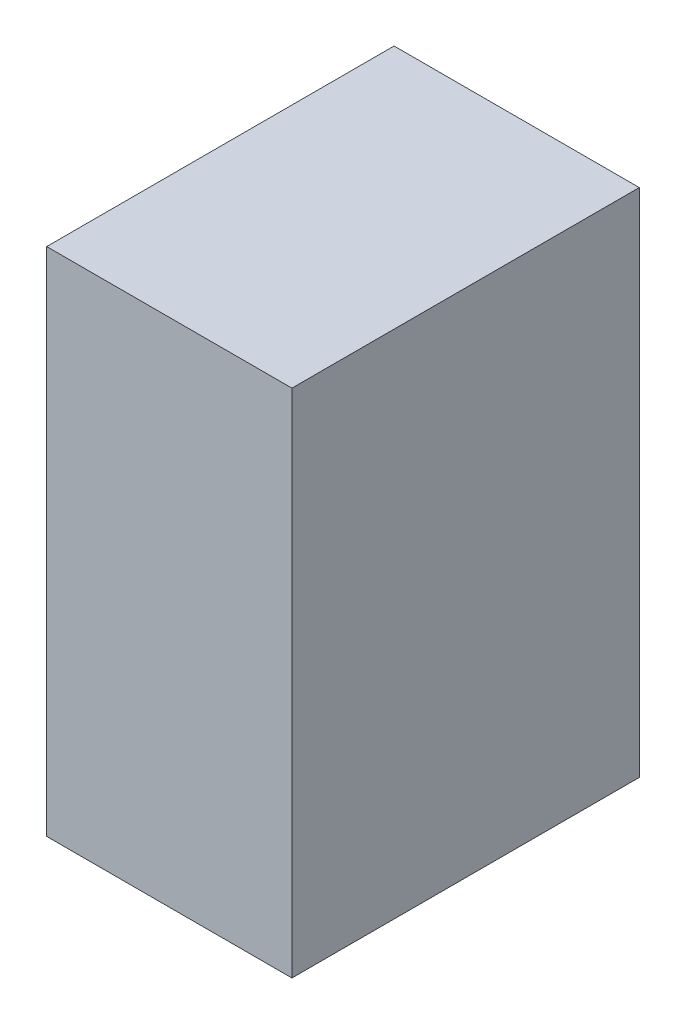
ISO-10303-21;
HEADER;
FILE_DESCRIPTION(('STEP AP214'),'2;1');
FILE_NAME('part.step','',(''),(''),'','','');
FILE_SCHEMA(('AUTOMOTIVE_DESIGN { 1 0 10303 214 1 1 1 1 }'));
ENDSEC;
DATA;
#1=APPLICATION_CONTEXT('core data for automotive mechanical design processes');
#2=APPLICATION_PROTOCOL_DEFINITION('international standard','automotive_design',2000,#1);
#3=PRODUCT_CONTEXT('',#1,'mechanical');
#4=PRODUCT('Part','Part','',(#3));
#5=PRODUCT_RELATED_PRODUCT_CATEGORY('part','',(#4));
#6=PRODUCT_DEFINITION_FORMATION('','',#4);
#7=PRODUCT_DEFINITION_CONTEXT('part definition',#1,'design');
#8=PRODUCT_DEFINITION('design','',#6,#7);
#9=PRODUCT_DEFINITION_SHAPE('','',#8);
#10=(LENGTH_UNIT() NAMED_UNIT(*) SI_UNIT(.MILLI.,.METRE.));
#11=(NAMED_UNIT(*) PLANE_ANGLE_UNIT() SI_UNIT($,.RADIAN.));
#12=(NAMED_UNIT(*) SI_UNIT($,.STERADIAN.) SOLID_ANGLE_UNIT());
#13=UNCERTAINTY_MEASURE_WITH_UNIT(LENGTH_MEASURE(1.E-05),#10,'distance_accuracy_value','');
#14=(GEOMETRIC_REPRESENTATION_CONTEXT(3) GLOBAL_UNCERTAINTY_ASSIGNED_CONTEXT((#13)) GLOBAL_UNIT_ASSIGNED_CONTEXT((#10,
#11,#12)) REPRESENTATION_CONTEXT('',''));
#15=CARTESIAN_POINT('',(0.,0.,0.));
#16=DIRECTION('',(0.,0.,1.));
#17=DIRECTION('',(1.,0.,0.));
#18=AXIS2_PLACEMENT_3D('',#15,#16,#17);
#19=CARTESIAN_POINT('',(-18.,-37.5,25.5));
#20=DIRECTION('',(1.,0.,0.));
#21=DIRECTION('',(0.,0.,-1.));
#22=AXIS2_PLACEMENT_3D('',#19,#20,#21);
#23=PLANE('',#22);
#24=DIRECTION('',(0.,-1.,0.));
#25=VECTOR('',#24,1.);
#26=CARTESIAN_POINT('',(-18.,-37.5,-25.5));
#27=LINE('',#26,#25);
#28=CARTESIAN_POINT('',(-18.,37.5,-25.5));
#29=VERTEX_POINT('',#28);
#30=CARTESIAN_POINT('',(-18.,-37.5,-25.5));
#31=VERTEX_POINT('',#30);
#32=EDGE_CURVE('E100',#29,#31,#27,.T.);
#33=ORIENTED_EDGE('',*,*,#32,.T.);
#34=DIRECTION('',(0.,0.,-1.));
#35=VECTOR('',#34,1.);
#36=CARTESIAN_POINT('',(-18.,-37.5,25.5));
#37=LINE('',#36,#35);
#38=CARTESIAN_POINT('',(-18.,-37.5,25.5));
#39=VERTEX_POINT('',#38);
#40=EDGE_CURVE('E11',#39,#31,#37,.T.);
#41=ORIENTED_EDGE('',*,*,#40,.F.);
#42=DIRECTION('',(0.,-1.,0.));
#43=VECTOR('',#42,1.);
#44=CARTESIAN_POINT('',(-18.,-37.5,25.5));
#45=LINE('',#44,#43);
#46=CARTESIAN_POINT('',(-18.,37.5,25.5));
#47=VERTEX_POINT('',#46);
#48=EDGE_CURVE('E88',#47,#39,#45,.T.);
#49=ORIENTED_EDGE('',*,*,#48,.F.);
#50=DIRECTION('',(0.,0.,-1.));
#51=VECTOR('',#50,1.);
#52=CARTESIAN_POINT('',(-18.,37.5,25.5));
#53=LINE('',#52,#51);
#54=EDGE_CURVE('E96',#47,#29,#53,.T.);
#55=ORIENTED_EDGE('',*,*,#54,.T.);
#56=EDGE_LOOP('',(#33,#41,#49,#55));
#57=FACE_BOUND('',#56,.T.);
#58=ADVANCED_FACE('F37',(#57),#23,.F.);
#59=CARTESIAN_POINT('',(18.,-37.5,25.5));
#60=DIRECTION('',(0.,1.,0.));
#61=DIRECTION('',(-1.,0.,0.));
#62=AXIS2_PLACEMENT_3D('',#59,#60,#61);
#63=PLANE('',#62);
#64=DIRECTION('',(1.,0.,0.));
#65=VECTOR('',#64,1.);
#66=CARTESIAN_POINT('',(18.,-37.5,-25.5));
#67=LINE('',#66,#65);
#68=CARTESIAN_POINT('',(18.,-37.5,-25.5));
#69=VERTEX_POINT('',#68);
#70=EDGE_CURVE('E92',#31,#69,#67,.T.);
#71=ORIENTED_EDGE('',*,*,#70,.T.);
#72=DIRECTION('',(0.,0.,-1.));
#73=VECTOR('',#72,1.);
#74=CARTESIAN_POINT('',(18.,-37.5,25.5));
#75=LINE('',#74,#73);
#76=CARTESIAN_POINT('',(18.,-37.5,25.5));
#77=VERTEX_POINT('',#76);
#78=EDGE_CURVE('E45',#77,#69,#75,.T.);
#79=ORIENTED_EDGE('',*,*,#78,.F.);
#80=DIRECTION('',(1.,0.,0.));
#81=VECTOR('',#80,1.);
#82=CARTESIAN_POINT('',(18.,-37.5,25.5));
#83=LINE('',#82,#81);
#84=EDGE_CURVE('E83',#39,#77,#83,.T.);
#85=ORIENTED_EDGE('',*,*,#84,.F.);
#86=ORIENTED_EDGE('',*,*,#40,.T.);
#87=EDGE_LOOP('',(#71,#79,#85,#86));
#88=FACE_BOUND('',#87,.T.);
#89=ADVANCED_FACE('F91',(#88),#63,.F.);
#90=CARTESIAN_POINT('',(18.,-37.5,25.5));
#91=DIRECTION('',(-1.,0.,0.));
#92=DIRECTION('',(0.,0.,1.));
#93=AXIS2_PLACEMENT_3D('',#90,#91,#92);
#94=PLANE('',#93);
#95=DIRECTION('',(0.,1.,0.));
#96=VECTOR('',#95,1.);
#97=CARTESIAN_POINT('',(18.,-37.5,-25.5));
#98=LINE('',#97,#96);
#99=CARTESIAN_POINT('',(18.,37.5,-25.5));
#100=VERTEX_POINT('',#99);
#101=EDGE_CURVE('E70',#69,#100,#98,.T.);
#102=ORIENTED_EDGE('',*,*,#101,.T.);
#103=DIRECTION('',(0.,0.,-1.));
#104=VECTOR('',#103,1.);
#105=CARTESIAN_POINT('',(18.,37.5,25.5));
#106=LINE('',#105,#104);
#107=CARTESIAN_POINT('',(18.,37.5,25.5));
#108=VERTEX_POINT('',#107);
#109=EDGE_CURVE('E93',#108,#100,#106,.T.);
#110=ORIENTED_EDGE('',*,*,#109,.F.);
#111=DIRECTION('',(0.,1.,0.));
#112=VECTOR('',#111,1.);
#113=CARTESIAN_POINT('',(18.,-37.5,25.5));
#114=LINE('',#113,#112);
#115=EDGE_CURVE('E86',#77,#108,#114,.T.);
#116=ORIENTED_EDGE('',*,*,#115,.F.);
#117=ORIENTED_EDGE('',*,*,#78,.T.);
#118=EDGE_LOOP('',(#102,#110,#116,#117));
#119=FACE_BOUND('',#118,.T.);
#120=ADVANCED_FACE('F94',(#119),#94,.F.);
#121=CARTESIAN_POINT('',(18.,37.5,25.5));
#122=DIRECTION('',(0.,-1.,0.));
#123=DIRECTION('',(0.,0.,-1.));
#124=AXIS2_PLACEMENT_3D('',#121,#122,#123);
#125=PLANE('',#124);
#126=DIRECTION('',(-1.,0.,0.));
#127=VECTOR('',#126,1.);
#128=CARTESIAN_POINT('',(18.,37.5,-25.5));
#129=LINE('',#128,#127);
#130=EDGE_CURVE('E76',#100,#29,#129,.T.);
#131=ORIENTED_EDGE('',*,*,#130,.T.);
#132=ORIENTED_EDGE('',*,*,#54,.F.);
#133=DIRECTION('',(-1.,0.,0.));
#134=VECTOR('',#133,1.);
#135=CARTESIAN_POINT('',(18.,37.5,25.5));
#136=LINE('',#135,#134);
#137=EDGE_CURVE('E53',#108,#47,#136,.T.);
#138=ORIENTED_EDGE('',*,*,#137,.F.);
#139=ORIENTED_EDGE('',*,*,#109,.T.);
#140=EDGE_LOOP('',(#131,#132,#138,#139));
#141=FACE_BOUND('',#140,.T.);
#142=ADVANCED_FACE('F107',(#141),#125,.F.);
#143=CARTESIAN_POINT('',(0.,0.,25.5));
#144=DIRECTION('',(0.,0.,1.));
#145=DIRECTION('',(1.,0.,0.));
#146=AXIS2_PLACEMENT_3D('',#143,#144,#145);
#147=PLANE('',#146);
#148=ORIENTED_EDGE('',*,*,#48,.T.);
#149=ORIENTED_EDGE('',*,*,#84,.T.);
#150=ORIENTED_EDGE('',*,*,#115,.T.);
#151=ORIENTED_EDGE('',*,*,#137,.T.);
#152=EDGE_LOOP('',(#148,#149,#150,#151));
#153=FACE_BOUND('',#152,.T.);
#154=ADVANCED_FACE('F84',(#153),#147,.T.);
#155=CARTESIAN_POINT('',(0.,0.,-25.5));
#156=DIRECTION('',(0.,0.,1.));
#157=DIRECTION('',(1.,0.,0.));
#158=AXIS2_PLACEMENT_3D('',#155,#156,#157);
#159=PLANE('',#158);
#160=ORIENTED_EDGE('',*,*,#32,.F.);
#161=ORIENTED_EDGE('',*,*,#130,.F.);
#162=ORIENTED_EDGE('',*,*,#101,.F.);
#163=ORIENTED_EDGE('',*,*,#70,.F.);
#164=EDGE_LOOP('',(#160,#161,#162,#163));
#165=FACE_BOUND('',#164,.T.);
#166=ADVANCED_FACE('F110',(#165),#159,.F.);
#167=CLOSED_SHELL('',(#58,#89,#120,#142,#154,#166));
#168=MANIFOLD_SOLID_BREP('B2',#167);
#169=ADVANCED_BREP_SHAPE_REPRESENTATION('',(#18,#168),#14);
#170=SHAPE_DEFINITION_REPRESENTATION(#9,#169);
ENDSEC;
END-ISO-10303-21;
